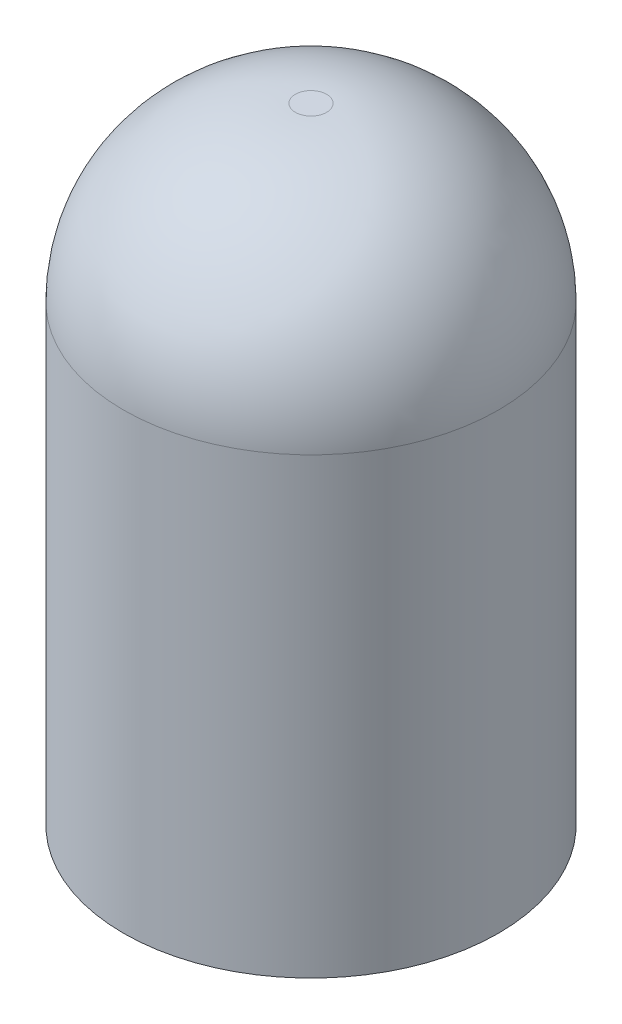
ISO-10303-21;
HEADER;
FILE_DESCRIPTION(('STEP AP214'),'2;1');
FILE_NAME('part.step','',(''),(''),'','','');
FILE_SCHEMA(('AUTOMOTIVE_DESIGN { 1 0 10303 214 1 1 1 1 }'));
ENDSEC;
DATA;
#1=APPLICATION_CONTEXT('core data for automotive mechanical design processes');
#2=APPLICATION_PROTOCOL_DEFINITION('international standard','automotive_design',2000,#1);
#3=PRODUCT_CONTEXT('',#1,'mechanical');
#4=PRODUCT('Part','Part','',(#3));
#5=PRODUCT_RELATED_PRODUCT_CATEGORY('part','',(#4));
#6=PRODUCT_DEFINITION_FORMATION('','',#4);
#7=PRODUCT_DEFINITION_CONTEXT('part definition',#1,'design');
#8=PRODUCT_DEFINITION('design','',#6,#7);
#9=PRODUCT_DEFINITION_SHAPE('','',#8);
#10=(LENGTH_UNIT() NAMED_UNIT(*) SI_UNIT(.MILLI.,.METRE.));
#11=(NAMED_UNIT(*) PLANE_ANGLE_UNIT() SI_UNIT($,.RADIAN.));
#12=(NAMED_UNIT(*) SI_UNIT($,.STERADIAN.) SOLID_ANGLE_UNIT());
#13=UNCERTAINTY_MEASURE_WITH_UNIT(LENGTH_MEASURE(1.E-05),#10,'distance_accuracy_value','');
#14=(GEOMETRIC_REPRESENTATION_CONTEXT(3) GLOBAL_UNCERTAINTY_ASSIGNED_CONTEXT((#13)) GLOBAL_UNIT_ASSIGNED_CONTEXT((#10,
#11,#12)) REPRESENTATION_CONTEXT('',''));
#15=CARTESIAN_POINT('',(0.,0.,0.));
#16=DIRECTION('',(0.,0.,1.));
#17=DIRECTION('',(1.,0.,0.));
#18=AXIS2_PLACEMENT_3D('',#15,#16,#17);
#19=CARTESIAN_POINT('',(0.,0.,0.));
#20=DIRECTION('',(0.,1.,0.));
#21=DIRECTION('',(-1.,0.,0.));
#22=AXIS2_PLACEMENT_3D('',#19,#20,#21);
#23=PLANE('',#22);
#24=CARTESIAN_POINT('',(0.,0.,0.));
#25=DIRECTION('',(0.,1.,0.));
#26=DIRECTION('',(-1.,0.,0.));
#27=AXIS2_PLACEMENT_3D('',#24,#25,#26);
#28=CIRCLE('',#27,57.9999999999998);
#29=CARTESIAN_POINT('',(-57.9999999999998,2.5657874186222E-13,0.));
#30=VERTEX_POINT('',#29);
#31=EDGE_CURVE('E45',#30,#30,#28,.T.);
#32=ORIENTED_EDGE('',*,*,#31,.T.);
#33=EDGE_LOOP('',(#32));
#34=FACE_BOUND('',#33,.T.);
#35=CARTESIAN_POINT('',(0.,1.66533453693773E-13,0.));
#36=DIRECTION('',(0.,1.,0.));
#37=DIRECTION('',(-1.,0.,0.));
#38=AXIS2_PLACEMENT_3D('',#35,#36,#37);
#39=CIRCLE('',#38,60.0000000000001);
#40=CARTESIAN_POINT('',(-60.0000000000001,3.45821745088946E-13,0.));
#41=VERTEX_POINT('',#40);
#42=EDGE_CURVE('E10',#41,#41,#39,.T.);
#43=ORIENTED_EDGE('',*,*,#42,.F.);
#44=EDGE_LOOP('',(#43));
#45=FACE_BOUND('',#44,.T.);
#46=ADVANCED_FACE('F31',(#34,#45),#23,.F.);
#47=CARTESIAN_POINT('',(5.97627637983908E-13,200.,0.));
#48=DIRECTION('',(0.,1.,0.));
#49=DIRECTION('',(-1.,0.,0.));
#50=AXIS2_PLACEMENT_3D('',#47,#48,#49);
#51=CYLINDRICAL_SURFACE('',#50,59.9999999999998);
#52=CARTESIAN_POINT('',(4.33280037538334E-13,145.,0.));
#53=DIRECTION('',(0.,1.,0.));
#54=DIRECTION('',(-1.,0.,0.));
#55=AXIS2_PLACEMENT_3D('',#52,#53,#54);
#56=CIRCLE('',#55,59.9999999999996);
#57=CARTESIAN_POINT('',(-59.9999999999992,145.,0.));
#58=VERTEX_POINT('',#57);
#59=EDGE_CURVE('E37',#58,#58,#56,.T.);
#60=ORIENTED_EDGE('',*,*,#59,.F.);
#61=EDGE_LOOP('',(#60));
#62=FACE_BOUND('',#61,.T.);
#63=ORIENTED_EDGE('',*,*,#42,.T.);
#64=EDGE_LOOP('',(#63));
#65=FACE_BOUND('',#64,.T.);
#66=ADVANCED_FACE('F74',(#62,#65),#51,.T.);
#67=CARTESIAN_POINT('',(4.33680868994202E-13,145.,0.));
#68=DIRECTION('',(0.,1.,0.));
#69=DIRECTION('',(-1.,0.,0.));
#70=AXIS2_PLACEMENT_3D('',#67,#68,#69);
#71=DEGENERATE_TOROIDAL_SURFACE('',#70,4.99999999999968,55.,.T.);
#72=CARTESIAN_POINT('',(5.97627637983908E-13,200.,0.));
#73=DIRECTION('',(0.,1.,0.));
#74=DIRECTION('',(-1.,0.,0.));
#75=AXIS2_PLACEMENT_3D('',#72,#73,#74);
#76=CIRCLE('',#75,4.99999999999952);
#77=CARTESIAN_POINT('',(-4.99999999999892,200.,0.));
#78=VERTEX_POINT('',#77);
#79=EDGE_CURVE('E41',#78,#78,#76,.T.);
#80=ORIENTED_EDGE('',*,*,#79,.F.);
#81=EDGE_LOOP('',(#80));
#82=FACE_BOUND('',#81,.T.);
#83=ORIENTED_EDGE('',*,*,#59,.T.);
#84=EDGE_LOOP('',(#83));
#85=FACE_BOUND('',#84,.T.);
#86=ADVANCED_FACE('F79',(#82,#85),#71,.T.);
#87=CARTESIAN_POINT('',(5.00000000000012,200.,0.));
#88=DIRECTION('',(0.,-1.,0.));
#89=DIRECTION('',(1.,0.,0.));
#90=AXIS2_PLACEMENT_3D('',#87,#88,#89);
#91=PLANE('',#90);
#92=ORIENTED_EDGE('',*,*,#79,.T.);
#93=EDGE_LOOP('',(#92));
#94=FACE_BOUND('',#93,.T.);
#95=ADVANCED_FACE('F71',(#94),#91,.F.);
#96=CARTESIAN_POINT('',(5.97627637983908E-13,200.,0.));
#97=DIRECTION('',(0.,1.,0.));
#98=DIRECTION('',(-1.,0.,0.));
#99=AXIS2_PLACEMENT_3D('',#96,#97,#98);
#100=CYLINDRICAL_SURFACE('',#99,57.9999999999998);
#101=CARTESIAN_POINT('',(4.33680868994202E-13,145.,0.));
#102=DIRECTION('',(0.,1.,0.));
#103=DIRECTION('',(-1.,0.,0.));
#104=AXIS2_PLACEMENT_3D('',#101,#102,#103);
#105=CIRCLE('',#104,57.9999999999997);
#106=CARTESIAN_POINT('',(-57.9999999999992,145.,0.));
#107=VERTEX_POINT('',#106);
#108=EDGE_CURVE('E50',#107,#107,#105,.T.);
#109=ORIENTED_EDGE('',*,*,#108,.T.);
#110=EDGE_LOOP('',(#109));
#111=FACE_BOUND('',#110,.T.);
#112=ORIENTED_EDGE('',*,*,#31,.F.);
#113=EDGE_LOOP('',(#112));
#114=FACE_BOUND('',#113,.T.);
#115=ADVANCED_FACE('F57',(#111,#114),#100,.F.);
#116=CARTESIAN_POINT('',(4.33680868994202E-13,145.,0.));
#117=DIRECTION('',(0.,1.,0.));
#118=DIRECTION('',(-1.,0.,0.));
#119=AXIS2_PLACEMENT_3D('',#116,#117,#118);
#120=DEGENERATE_TOROIDAL_SURFACE('',#119,4.99999999999968,53.,.T.);
#121=CARTESIAN_POINT('',(5.92052193059937E-13,198.,0.));
#122=DIRECTION('',(0.,1.,0.));
#123=DIRECTION('',(-1.,0.,0.));
#124=AXIS2_PLACEMENT_3D('',#121,#122,#123);
#125=CIRCLE('',#124,4.99999999999953);
#126=CARTESIAN_POINT('',(-4.99999999999894,198.,0.));
#127=VERTEX_POINT('',#126);
#128=EDGE_CURVE('E51',#127,#127,#125,.T.);
#129=ORIENTED_EDGE('',*,*,#128,.T.);
#130=EDGE_LOOP('',(#129));
#131=FACE_BOUND('',#130,.T.);
#132=ORIENTED_EDGE('',*,*,#108,.F.);
#133=EDGE_LOOP('',(#132));
#134=FACE_BOUND('',#133,.T.);
#135=ADVANCED_FACE('F60',(#131,#134),#120,.F.);
#136=CARTESIAN_POINT('',(5.00000000000011,198.,0.));
#137=DIRECTION('',(0.,-1.,0.));
#138=DIRECTION('',(1.,0.,0.));
#139=AXIS2_PLACEMENT_3D('',#136,#137,#138);
#140=PLANE('',#139);
#141=ORIENTED_EDGE('',*,*,#128,.F.);
#142=EDGE_LOOP('',(#141));
#143=FACE_BOUND('',#142,.T.);
#144=ADVANCED_FACE('F62',(#143),#140,.T.);
#145=CLOSED_SHELL('',(#46,#66,#86,#95,#115,#135,#144));
#146=MANIFOLD_SOLID_BREP('B2',#145);
#147=ADVANCED_BREP_SHAPE_REPRESENTATION('',(#18,#146),#14);
#148=SHAPE_DEFINITION_REPRESENTATION(#9,#147);
ENDSEC;
END-ISO-10303-21;
